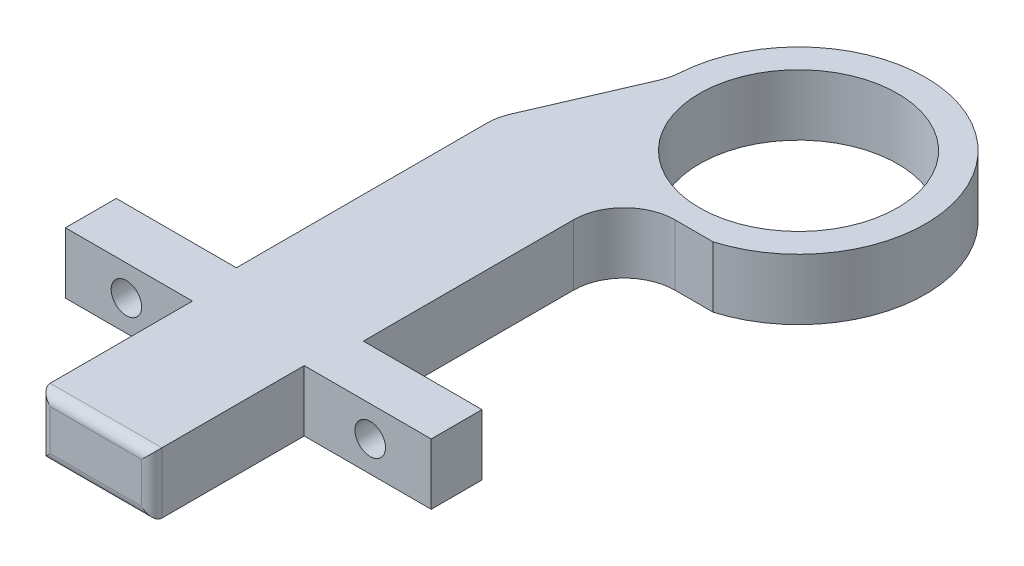
ISO-10303-21;
HEADER;
FILE_DESCRIPTION(('STEP AP214'),'2;1');
FILE_NAME('part.step','',(''),(''),'','','');
FILE_SCHEMA(('AUTOMOTIVE_DESIGN { 1 0 10303 214 1 1 1 1 }'));
ENDSEC;
DATA;
#1=APPLICATION_CONTEXT('core data for automotive mechanical design processes');
#2=APPLICATION_PROTOCOL_DEFINITION('international standard','automotive_design',2000,#1);
#3=PRODUCT_CONTEXT('',#1,'mechanical');
#4=PRODUCT('Part','Part','',(#3));
#5=PRODUCT_RELATED_PRODUCT_CATEGORY('part','',(#4));
#6=PRODUCT_DEFINITION_FORMATION('','',#4);
#7=PRODUCT_DEFINITION_CONTEXT('part definition',#1,'design');
#8=PRODUCT_DEFINITION('design','',#6,#7);
#9=PRODUCT_DEFINITION_SHAPE('','',#8);
#10=(LENGTH_UNIT() NAMED_UNIT(*) SI_UNIT(.MILLI.,.METRE.));
#11=(NAMED_UNIT(*) PLANE_ANGLE_UNIT() SI_UNIT($,.RADIAN.));
#12=(NAMED_UNIT(*) SI_UNIT($,.STERADIAN.) SOLID_ANGLE_UNIT());
#13=UNCERTAINTY_MEASURE_WITH_UNIT(LENGTH_MEASURE(1.E-05),#10,'distance_accuracy_value','');
#14=(GEOMETRIC_REPRESENTATION_CONTEXT(3) GLOBAL_UNCERTAINTY_ASSIGNED_CONTEXT((#13)) GLOBAL_UNIT_ASSIGNED_CONTEXT((#10,
#11,#12)) REPRESENTATION_CONTEXT('',''));
#15=CARTESIAN_POINT('',(0.,0.,0.));
#16=DIRECTION('',(0.,0.,1.));
#17=DIRECTION('',(1.,0.,0.));
#18=AXIS2_PLACEMENT_3D('',#15,#16,#17);
#19=CARTESIAN_POINT('',(0.,6.,16.));
#20=DIRECTION('',(0.,0.,1.));
#21=DIRECTION('',(1.,0.,0.));
#22=AXIS2_PLACEMENT_3D('',#19,#20,#21);
#23=PLANE('',#22);
#24=CARTESIAN_POINT('',(-12.,3.,16.));
#25=DIRECTION('',(0.,0.,1.));
#26=DIRECTION('',(1.,0.,0.));
#27=AXIS2_PLACEMENT_3D('',#24,#25,#26);
#28=CIRCLE('',#27,1.5);
#29=CARTESIAN_POINT('',(-10.5,3.,16.));
#30=VERTEX_POINT('',#29);
#31=EDGE_CURVE('E232',#30,#30,#28,.T.);
#32=ORIENTED_EDGE('',*,*,#31,.T.);
#33=EDGE_LOOP('',(#32));
#34=FACE_BOUND('',#33,.T.);
#35=DIRECTION('',(-1.,0.,0.));
#36=VECTOR('',#35,1.);
#37=CARTESIAN_POINT('',(0.,0.,16.));
#38=LINE('',#37,#36);
#39=CARTESIAN_POINT('',(-6.,0.,16.));
#40=VERTEX_POINT('',#39);
#41=CARTESIAN_POINT('',(-17.6776695296638,0.,16.));
#42=VERTEX_POINT('',#41);
#43=EDGE_CURVE('E192',#40,#42,#38,.T.);
#44=ORIENTED_EDGE('',*,*,#43,.T.);
#45=DIRECTION('',(0.,-1.,0.));
#46=VECTOR('',#45,1.);
#47=CARTESIAN_POINT('',(-17.6776695296638,6.,16.));
#48=LINE('',#47,#46);
#49=CARTESIAN_POINT('',(-17.6776695296638,6.,16.));
#50=VERTEX_POINT('',#49);
#51=EDGE_CURVE('E173',#50,#42,#48,.T.);
#52=ORIENTED_EDGE('',*,*,#51,.F.);
#53=DIRECTION('',(-1.,0.,0.));
#54=VECTOR('',#53,1.);
#55=CARTESIAN_POINT('',(0.,6.,16.));
#56=LINE('',#55,#54);
#57=CARTESIAN_POINT('',(-6.,6.,16.));
#58=VERTEX_POINT('',#57);
#59=EDGE_CURVE('E179',#58,#50,#56,.T.);
#60=ORIENTED_EDGE('',*,*,#59,.F.);
#61=DIRECTION('',(0.,-1.,0.));
#62=VECTOR('',#61,1.);
#63=CARTESIAN_POINT('',(-6.,6.,16.));
#64=LINE('',#63,#62);
#65=EDGE_CURVE('E270',#58,#40,#64,.T.);
#66=ORIENTED_EDGE('',*,*,#65,.T.);
#67=EDGE_LOOP('',(#44,#52,#60,#66));
#68=FACE_BOUND('',#67,.T.);
#69=ADVANCED_FACE('F35',(#34,#68),#23,.F.);
#70=CARTESIAN_POINT('',(-17.6776695296638,6.,0.));
#71=DIRECTION('',(-1.,0.,0.));
#72=DIRECTION('',(0.,0.,1.));
#73=AXIS2_PLACEMENT_3D('',#70,#71,#72);
#74=PLANE('',#73);
#75=DIRECTION('',(0.,0.,-1.));
#76=VECTOR('',#75,1.);
#77=CARTESIAN_POINT('',(-17.6776695296638,0.,0.));
#78=LINE('',#77,#76);
#79=CARTESIAN_POINT('',(-17.6776695296638,0.,-4.67169950086209));
#80=VERTEX_POINT('',#79);
#81=EDGE_CURVE('E272',#42,#80,#78,.T.);
#82=ORIENTED_EDGE('',*,*,#81,.T.);
#83=DIRECTION('',(0.,-1.,0.));
#84=VECTOR('',#83,1.);
#85=CARTESIAN_POINT('',(-17.6776695296638,6.,-4.67169950086209));
#86=LINE('',#85,#84);
#87=CARTESIAN_POINT('',(-17.6776695296638,6.,-4.67169950086209));
#88=VERTEX_POINT('',#87);
#89=EDGE_CURVE('E176',#88,#80,#86,.T.);
#90=ORIENTED_EDGE('',*,*,#89,.F.);
#91=DIRECTION('',(0.,0.,-1.));
#92=VECTOR('',#91,1.);
#93=CARTESIAN_POINT('',(-17.6776695296638,6.,0.));
#94=LINE('',#93,#92);
#95=EDGE_CURVE('E169',#50,#88,#94,.T.);
#96=ORIENTED_EDGE('',*,*,#95,.F.);
#97=ORIENTED_EDGE('',*,*,#51,.T.);
#98=EDGE_LOOP('',(#82,#90,#96,#97));
#99=FACE_BOUND('',#98,.T.);
#100=ADVANCED_FACE('F171',(#99),#74,.F.);
#101=CARTESIAN_POINT('',(-12.6776695296638,6.,-4.67169950086212));
#102=DIRECTION('',(0.,-1.,0.));
#103=DIRECTION('',(0.,0.,-1.));
#104=AXIS2_PLACEMENT_3D('',#101,#102,#103);
#105=CYLINDRICAL_SURFACE('',#104,5.);
#106=CARTESIAN_POINT('',(-12.6776695296638,0.,-4.67169950086212));
#107=DIRECTION('',(0.,1.,0.));
#108=DIRECTION('',(0.,0.,1.));
#109=AXIS2_PLACEMENT_3D('',#106,#107,#108);
#110=CIRCLE('',#109,5.);
#111=CARTESIAN_POINT('',(-12.6776695296638,0.,-9.67169950086212));
#112=VERTEX_POINT('',#111);
#113=EDGE_CURVE('E275',#80,#112,#110,.F.);
#114=ORIENTED_EDGE('',*,*,#113,.T.);
#115=DIRECTION('',(0.,-1.,0.));
#116=VECTOR('',#115,1.);
#117=CARTESIAN_POINT('',(-12.6776695296638,6.,-9.67169950086212));
#118=LINE('',#117,#116);
#119=CARTESIAN_POINT('',(-12.6776695296638,6.,-9.67169950086212));
#120=VERTEX_POINT('',#119);
#121=EDGE_CURVE('E197',#120,#112,#118,.T.);
#122=ORIENTED_EDGE('',*,*,#121,.F.);
#123=CARTESIAN_POINT('',(-12.6776695296638,6.,-4.67169950086212));
#124=DIRECTION('',(0.,1.,0.));
#125=DIRECTION('',(0.,0.,1.));
#126=AXIS2_PLACEMENT_3D('',#123,#124,#125);
#127=CIRCLE('',#126,5.);
#128=EDGE_CURVE('E178',#88,#120,#127,.F.);
#129=ORIENTED_EDGE('',*,*,#128,.F.);
#130=ORIENTED_EDGE('',*,*,#89,.T.);
#131=EDGE_LOOP('',(#114,#122,#129,#130));
#132=FACE_BOUND('',#131,.T.);
#133=ADVANCED_FACE('F343',(#132),#105,.F.);
#134=CARTESIAN_POINT('',(0.,6.,-9.67169950086212));
#135=DIRECTION('',(0.,0.,1.));
#136=DIRECTION('',(1.,0.,0.));
#137=AXIS2_PLACEMENT_3D('',#134,#135,#136);
#138=PLANE('',#137);
#139=DIRECTION('',(-1.,0.,0.));
#140=VECTOR('',#139,1.);
#141=CARTESIAN_POINT('',(0.,0.,-9.67169950086212));
#142=LINE('',#141,#140);
#143=CARTESIAN_POINT('',(-8.92857142857138,0.,-9.67169950086212));
#144=VERTEX_POINT('',#143);
#145=EDGE_CURVE('E278',#144,#112,#142,.T.);
#146=ORIENTED_EDGE('',*,*,#145,.F.);
#147=DIRECTION('',(0.,-1.,0.));
#148=VECTOR('',#147,1.);
#149=CARTESIAN_POINT('',(-8.92857142857138,6.,-9.67169950086212));
#150=LINE('',#149,#148);
#151=CARTESIAN_POINT('',(-8.92857142857138,6.,-9.67169950086212));
#152=VERTEX_POINT('',#151);
#153=EDGE_CURVE('E335',#152,#144,#150,.T.);
#154=ORIENTED_EDGE('',*,*,#153,.F.);
#155=DIRECTION('',(-1.,0.,0.));
#156=VECTOR('',#155,1.);
#157=CARTESIAN_POINT('',(0.,6.,-9.67169950086212));
#158=LINE('',#157,#156);
#159=EDGE_CURVE('E241',#152,#120,#158,.T.);
#160=ORIENTED_EDGE('',*,*,#159,.T.);
#161=ORIENTED_EDGE('',*,*,#121,.T.);
#162=EDGE_LOOP('',(#146,#154,#160,#161));
#163=FACE_BOUND('',#162,.T.);
#164=ADVANCED_FACE('F339',(#163),#138,.T.);
#165=CARTESIAN_POINT('',(-12.5,6.,-21.650635094611));
#166=DIRECTION('',(0.,-1.,0.));
#167=DIRECTION('',(0.,0.,-1.));
#168=AXIS2_PLACEMENT_3D('',#165,#166,#167);
#169=CYLINDRICAL_SURFACE('',#168,12.5);
#170=CARTESIAN_POINT('',(-12.5,0.,-21.650635094611));
#171=DIRECTION('',(0.,1.,0.));
#172=DIRECTION('',(0.,0.,1.));
#173=AXIS2_PLACEMENT_3D('',#170,#171,#172);
#174=CIRCLE('',#173,12.5);
#175=CARTESIAN_POINT('',(-24.9745166094324,0.,-22.4484040843536));
#176=VERTEX_POINT('',#175);
#177=EDGE_CURVE('E281',#144,#176,#174,.T.);
#178=ORIENTED_EDGE('',*,*,#177,.T.);
#179=DIRECTION('',(0.,-1.,0.));
#180=VECTOR('',#179,1.);
#181=CARTESIAN_POINT('',(-24.9745166094324,6.,-22.4484040843536));
#182=LINE('',#181,#180);
#183=CARTESIAN_POINT('',(-24.9745166094324,6.,-22.4484040843536));
#184=VERTEX_POINT('',#183);
#185=EDGE_CURVE('E332',#184,#176,#182,.T.);
#186=ORIENTED_EDGE('',*,*,#185,.F.);
#187=CARTESIAN_POINT('',(-12.5,6.,-21.650635094611));
#188=DIRECTION('',(0.,1.,0.));
#189=DIRECTION('',(0.,0.,1.));
#190=AXIS2_PLACEMENT_3D('',#187,#188,#189);
#191=CIRCLE('',#190,12.5);
#192=EDGE_CURVE('E244',#152,#184,#191,.T.);
#193=ORIENTED_EDGE('',*,*,#192,.F.);
#194=ORIENTED_EDGE('',*,*,#153,.T.);
#195=EDGE_LOOP('',(#178,#186,#193,#194));
#196=FACE_BOUND('',#195,.T.);
#197=ADVANCED_FACE('F351',(#196),#169,.T.);
#198=CARTESIAN_POINT('',(-29.9643232532053,6.,-22.7675116802506));
#199=DIRECTION('',(0.,-1.,0.));
#200=DIRECTION('',(0.,0.,-1.));
#201=AXIS2_PLACEMENT_3D('',#198,#199,#200);
#202=CYLINDRICAL_SURFACE('',#201,5.);
#203=CARTESIAN_POINT('',(-29.9643232532053,0.,-22.7675116802506));
#204=DIRECTION('',(0.,1.,0.));
#205=DIRECTION('',(0.,0.,1.));
#206=AXIS2_PLACEMENT_3D('',#203,#204,#205);
#207=CIRCLE('',#206,5.);
#208=CARTESIAN_POINT('',(-25.3747016471425,0.,-20.7837340936344));
#209=VERTEX_POINT('',#208);
#210=EDGE_CURVE('E283',#176,#209,#207,.F.);
#211=ORIENTED_EDGE('',*,*,#210,.T.);
#212=DIRECTION('',(0.,-1.,0.));
#213=VECTOR('',#212,1.);
#214=CARTESIAN_POINT('',(-25.3747016471425,6.,-20.7837340936344));
#215=LINE('',#214,#213);
#216=CARTESIAN_POINT('',(-25.3747016471425,6.,-20.7837340936344));
#217=VERTEX_POINT('',#216);
#218=EDGE_CURVE('E330',#217,#209,#215,.T.);
#219=ORIENTED_EDGE('',*,*,#218,.F.);
#220=CARTESIAN_POINT('',(-29.9643232532053,6.,-22.7675116802506));
#221=DIRECTION('',(0.,1.,0.));
#222=DIRECTION('',(0.,0.,1.));
#223=AXIS2_PLACEMENT_3D('',#220,#221,#222);
#224=CIRCLE('',#223,5.);
#225=EDGE_CURVE('E246',#184,#217,#224,.F.);
#226=ORIENTED_EDGE('',*,*,#225,.F.);
#227=ORIENTED_EDGE('',*,*,#185,.T.);
#228=EDGE_LOOP('',(#211,#219,#226,#227));
#229=FACE_BOUND('',#228,.T.);
#230=ADVANCED_FACE('F355',(#229),#202,.F.);
#231=CARTESIAN_POINT('',(-28.9496046006768,6.,-12.5129219089349));
#232=DIRECTION('',(-0.917924321212573,0.,-0.396755517323247));
#233=DIRECTION('',(-0.396755517323247,0.,0.917924321212573));
#234=AXIS2_PLACEMENT_3D('',#231,#232,#233);
#235=PLANE('',#234);
#236=DIRECTION('',(0.396755517323247,0.,-0.917924321212573));
#237=VECTOR('',#236,1.);
#238=CARTESIAN_POINT('',(-28.9496046006768,0.,-12.5129219089349));
#239=LINE('',#238,#237);
#240=CARTESIAN_POINT('',(-29.7672911357266,0.,-10.6211413920209));
#241=VERTEX_POINT('',#240);
#242=EDGE_CURVE('E286',#241,#209,#239,.T.);
#243=ORIENTED_EDGE('',*,*,#242,.F.);
#244=DIRECTION('',(0.,-1.,0.));
#245=VECTOR('',#244,1.);
#246=CARTESIAN_POINT('',(-29.7672911357266,6.,-10.6211413920209));
#247=LINE('',#246,#245);
#248=CARTESIAN_POINT('',(-29.7672911357266,6.,-10.6211413920209));
#249=VERTEX_POINT('',#248);
#250=EDGE_CURVE('E328',#249,#241,#247,.T.);
#251=ORIENTED_EDGE('',*,*,#250,.F.);
#252=DIRECTION('',(0.396755517323247,0.,-0.917924321212573));
#253=VECTOR('',#252,1.);
#254=CARTESIAN_POINT('',(-28.9496046006768,6.,-12.5129219089349));
#255=LINE('',#254,#253);
#256=EDGE_CURVE('E248',#249,#217,#255,.T.);
#257=ORIENTED_EDGE('',*,*,#256,.T.);
#258=ORIENTED_EDGE('',*,*,#218,.T.);
#259=EDGE_LOOP('',(#243,#251,#257,#258));
#260=FACE_BOUND('',#259,.T.);
#261=ADVANCED_FACE('F515',(#260),#235,.T.);
#262=CARTESIAN_POINT('',(-25.1776695296638,6.,-8.63736380540464));
#263=DIRECTION('',(0.,-1.,0.));
#264=DIRECTION('',(0.,0.,-1.));
#265=AXIS2_PLACEMENT_3D('',#262,#263,#264);
#266=CYLINDRICAL_SURFACE('',#265,5.);
#267=CARTESIAN_POINT('',(-25.1776695296638,0.,-8.63736380540464));
#268=DIRECTION('',(0.,1.,0.));
#269=DIRECTION('',(0.,0.,1.));
#270=AXIS2_PLACEMENT_3D('',#267,#268,#269);
#271=CIRCLE('',#270,5.);
#272=CARTESIAN_POINT('',(-30.1776695296638,0.,-8.63736380540462));
#273=VERTEX_POINT('',#272);
#274=EDGE_CURVE('E289',#273,#241,#271,.F.);
#275=ORIENTED_EDGE('',*,*,#274,.F.);
#276=DIRECTION('',(0.,-1.,0.));
#277=VECTOR('',#276,1.);
#278=CARTESIAN_POINT('',(-30.1776695296638,6.,-8.63736380540462));
#279=LINE('',#278,#277);
#280=CARTESIAN_POINT('',(-30.1776695296638,6.,-8.63736380540462));
#281=VERTEX_POINT('',#280);
#282=EDGE_CURVE('E326',#281,#273,#279,.T.);
#283=ORIENTED_EDGE('',*,*,#282,.F.);
#284=CARTESIAN_POINT('',(-25.1776695296638,6.,-8.63736380540464));
#285=DIRECTION('',(0.,1.,0.));
#286=DIRECTION('',(0.,0.,1.));
#287=AXIS2_PLACEMENT_3D('',#284,#285,#286);
#288=CIRCLE('',#287,5.);
#289=EDGE_CURVE('E251',#281,#249,#288,.F.);
#290=ORIENTED_EDGE('',*,*,#289,.T.);
#291=ORIENTED_EDGE('',*,*,#250,.T.);
#292=EDGE_LOOP('',(#275,#283,#290,#291));
#293=FACE_BOUND('',#292,.T.);
#294=ADVANCED_FACE('F363',(#293),#266,.T.);
#295=CARTESIAN_POINT('',(-30.1776695296638,6.,0.));
#296=DIRECTION('',(-1.,0.,0.));
#297=DIRECTION('',(0.,0.,1.));
#298=AXIS2_PLACEMENT_3D('',#295,#296,#297);
#299=PLANE('',#298);
#300=DIRECTION('',(0.,0.,-1.));
#301=VECTOR('',#300,1.);
#302=CARTESIAN_POINT('',(-30.1776695296638,0.,0.));
#303=LINE('',#302,#301);
#304=CARTESIAN_POINT('',(-30.1776695296638,0.,16.));
#305=VERTEX_POINT('',#304);
#306=EDGE_CURVE('E292',#305,#273,#303,.T.);
#307=ORIENTED_EDGE('',*,*,#306,.F.);
#308=DIRECTION('',(0.,-1.,0.));
#309=VECTOR('',#308,1.);
#310=CARTESIAN_POINT('',(-30.1776695296638,6.,16.));
#311=LINE('',#310,#309);
#312=CARTESIAN_POINT('',(-30.1776695296638,6.,16.));
#313=VERTEX_POINT('',#312);
#314=EDGE_CURVE('E324',#313,#305,#311,.T.);
#315=ORIENTED_EDGE('',*,*,#314,.F.);
#316=DIRECTION('',(0.,0.,-1.));
#317=VECTOR('',#316,1.);
#318=CARTESIAN_POINT('',(-30.1776695296638,6.,0.));
#319=LINE('',#318,#317);
#320=EDGE_CURVE('E254',#313,#281,#319,.T.);
#321=ORIENTED_EDGE('',*,*,#320,.T.);
#322=ORIENTED_EDGE('',*,*,#282,.T.);
#323=EDGE_LOOP('',(#307,#315,#321,#322));
#324=FACE_BOUND('',#323,.T.);
#325=ADVANCED_FACE('F367',(#324),#299,.T.);
#326=CARTESIAN_POINT('',(-36.,3.,16.));
#327=DIRECTION('',(0.,0.,1.));
#328=DIRECTION('',(1.,0.,0.));
#329=AXIS2_PLACEMENT_3D('',#326,#327,#328);
#330=CIRCLE('',#329,1.5);
#331=CARTESIAN_POINT('',(-34.5,3.,16.));
#332=VERTEX_POINT('',#331);
#333=EDGE_CURVE('E237',#332,#332,#330,.T.);
#334=ORIENTED_EDGE('',*,*,#333,.T.);
#335=EDGE_LOOP('',(#334));
#336=FACE_BOUND('',#335,.T.);
#337=CARTESIAN_POINT('',(-42.,0.,16.));
#338=VERTEX_POINT('',#337);
#339=EDGE_CURVE('E273',#305,#338,#38,.T.);
#340=ORIENTED_EDGE('',*,*,#339,.T.);
#341=DIRECTION('',(0.,-1.,0.));
#342=VECTOR('',#341,1.);
#343=CARTESIAN_POINT('',(-42.,6.,16.));
#344=LINE('',#343,#342);
#345=CARTESIAN_POINT('',(-42.,6.,16.));
#346=VERTEX_POINT('',#345);
#347=EDGE_CURVE('E321',#346,#338,#344,.T.);
#348=ORIENTED_EDGE('',*,*,#347,.F.);
#349=EDGE_CURVE('E190',#313,#346,#56,.T.);
#350=ORIENTED_EDGE('',*,*,#349,.F.);
#351=ORIENTED_EDGE('',*,*,#314,.T.);
#352=EDGE_LOOP('',(#340,#348,#350,#351));
#353=FACE_BOUND('',#352,.T.);
#354=ADVANCED_FACE('F373',(#336,#353),#23,.F.);
#355=CARTESIAN_POINT('',(-42.,6.,0.));
#356=DIRECTION('',(1.,0.,0.));
#357=DIRECTION('',(0.,0.,-1.));
#358=AXIS2_PLACEMENT_3D('',#355,#356,#357);
#359=PLANE('',#358);
#360=DIRECTION('',(0.,0.,1.));
#361=VECTOR('',#360,1.);
#362=CARTESIAN_POINT('',(-42.,0.,0.));
#363=LINE('',#362,#361);
#364=CARTESIAN_POINT('',(-42.,0.,21.));
#365=VERTEX_POINT('',#364);
#366=EDGE_CURVE('E295',#338,#365,#363,.T.);
#367=ORIENTED_EDGE('',*,*,#366,.T.);
#368=DIRECTION('',(0.,-1.,0.));
#369=VECTOR('',#368,1.);
#370=CARTESIAN_POINT('',(-42.,6.,21.));
#371=LINE('',#370,#369);
#372=CARTESIAN_POINT('',(-42.,6.,21.));
#373=VERTEX_POINT('',#372);
#374=EDGE_CURVE('E318',#373,#365,#371,.T.);
#375=ORIENTED_EDGE('',*,*,#374,.F.);
#376=DIRECTION('',(0.,0.,1.));
#377=VECTOR('',#376,1.);
#378=CARTESIAN_POINT('',(-42.,6.,0.));
#379=LINE('',#378,#377);
#380=EDGE_CURVE('E257',#346,#373,#379,.T.);
#381=ORIENTED_EDGE('',*,*,#380,.F.);
#382=ORIENTED_EDGE('',*,*,#347,.T.);
#383=EDGE_LOOP('',(#367,#375,#381,#382));
#384=FACE_BOUND('',#383,.T.);
#385=ADVANCED_FACE('F377',(#384),#359,.F.);
#386=CARTESIAN_POINT('',(0.,6.,21.));
#387=DIRECTION('',(0.,0.,-1.));
#388=DIRECTION('',(-1.,0.,0.));
#389=AXIS2_PLACEMENT_3D('',#386,#387,#388);
#390=PLANE('',#389);
#391=CARTESIAN_POINT('',(-36.,3.,21.));
#392=DIRECTION('',(0.,0.,1.));
#393=DIRECTION('',(1.,0.,0.));
#394=AXIS2_PLACEMENT_3D('',#391,#392,#393);
#395=CIRCLE('',#394,1.5);
#396=CARTESIAN_POINT('',(-34.5,3.,21.));
#397=VERTEX_POINT('',#396);
#398=EDGE_CURVE('E227',#397,#397,#395,.T.);
#399=ORIENTED_EDGE('',*,*,#398,.F.);
#400=EDGE_LOOP('',(#399));
#401=FACE_BOUND('',#400,.T.);
#402=DIRECTION('',(1.,0.,0.));
#403=VECTOR('',#402,1.);
#404=CARTESIAN_POINT('',(0.,0.,21.));
#405=LINE('',#404,#403);
#406=CARTESIAN_POINT('',(-29.5,0.,21.));
#407=VERTEX_POINT('',#406);
#408=EDGE_CURVE('E297',#365,#407,#405,.T.);
#409=ORIENTED_EDGE('',*,*,#408,.T.);
#410=DIRECTION('',(0.,-1.,0.));
#411=VECTOR('',#410,1.);
#412=CARTESIAN_POINT('',(-29.5,6.,21.));
#413=LINE('',#412,#411);
#414=CARTESIAN_POINT('',(-29.5,6.,21.));
#415=VERTEX_POINT('',#414);
#416=EDGE_CURVE('E315',#415,#407,#413,.T.);
#417=ORIENTED_EDGE('',*,*,#416,.F.);
#418=DIRECTION('',(1.,0.,0.));
#419=VECTOR('',#418,1.);
#420=CARTESIAN_POINT('',(0.,6.,21.));
#421=LINE('',#420,#419);
#422=EDGE_CURVE('E259',#373,#415,#421,.T.);
#423=ORIENTED_EDGE('',*,*,#422,.F.);
#424=ORIENTED_EDGE('',*,*,#374,.T.);
#425=EDGE_LOOP('',(#409,#417,#423,#424));
#426=FACE_BOUND('',#425,.T.);
#427=ADVANCED_FACE('F382',(#401,#426),#390,.F.);
#428=CARTESIAN_POINT('',(-29.5,6.,0.));
#429=DIRECTION('',(1.,0.,0.));
#430=DIRECTION('',(0.,0.,-1.));
#431=AXIS2_PLACEMENT_3D('',#428,#429,#430);
#432=PLANE('',#431);
#433=DIRECTION('',(0.,0.,1.));
#434=VECTOR('',#433,1.);
#435=CARTESIAN_POINT('',(-29.5,0.,0.));
#436=LINE('',#435,#434);
#437=CARTESIAN_POINT('',(-29.5,0.,35.));
#438=VERTEX_POINT('',#437);
#439=EDGE_CURVE('E299',#407,#438,#436,.T.);
#440=ORIENTED_EDGE('',*,*,#439,.T.);
#441=DIRECTION('',(0.,-1.,0.));
#442=VECTOR('',#441,1.);
#443=CARTESIAN_POINT('',(-29.5,6.,35.));
#444=LINE('',#443,#442);
#445=CARTESIAN_POINT('',(-29.5,6.,35.));
#446=VERTEX_POINT('',#445);
#447=EDGE_CURVE('E207',#438,#446,#444,.F.);
#448=ORIENTED_EDGE('',*,*,#447,.T.);
#449=DIRECTION('',(0.,0.,1.));
#450=VECTOR('',#449,1.);
#451=CARTESIAN_POINT('',(-29.5,6.,0.));
#452=LINE('',#451,#450);
#453=EDGE_CURVE('E261',#415,#446,#452,.T.);
#454=ORIENTED_EDGE('',*,*,#453,.F.);
#455=ORIENTED_EDGE('',*,*,#416,.T.);
#456=EDGE_LOOP('',(#440,#448,#454,#455));
#457=FACE_BOUND('',#456,.T.);
#458=ADVANCED_FACE('F385',(#457),#432,.F.);
#459=CARTESIAN_POINT('',(0.,6.,36.));
#460=DIRECTION('',(0.,0.,-1.));
#461=DIRECTION('',(-1.,0.,0.));
#462=AXIS2_PLACEMENT_3D('',#459,#460,#461);
#463=PLANE('',#462);
#464=DIRECTION('',(1.,0.,0.));
#465=VECTOR('',#464,1.);
#466=CARTESIAN_POINT('',(-29.5,5.,36.));
#467=LINE('',#466,#465);
#468=CARTESIAN_POINT('',(-19.5,5.,36.));
#469=VERTEX_POINT('',#468);
#470=CARTESIAN_POINT('',(-28.5,5.,36.));
#471=VERTEX_POINT('',#470);
#472=EDGE_CURVE('E202',#469,#471,#467,.F.);
#473=ORIENTED_EDGE('',*,*,#472,.T.);
#474=DIRECTION('',(0.,-1.,0.));
#475=VECTOR('',#474,1.);
#476=CARTESIAN_POINT('',(-28.5,6.,36.));
#477=LINE('',#476,#475);
#478=CARTESIAN_POINT('',(-28.5,1.,36.));
#479=VERTEX_POINT('',#478);
#480=EDGE_CURVE('E204',#471,#479,#477,.T.);
#481=ORIENTED_EDGE('',*,*,#480,.T.);
#482=DIRECTION('',(1.,0.,0.));
#483=VECTOR('',#482,1.);
#484=CARTESIAN_POINT('',(0.,1.,36.));
#485=LINE('',#484,#483);
#486=CARTESIAN_POINT('',(-19.5,1.,36.));
#487=VERTEX_POINT('',#486);
#488=EDGE_CURVE('E193',#479,#487,#485,.T.);
#489=ORIENTED_EDGE('',*,*,#488,.T.);
#490=DIRECTION('',(0.,-1.,0.));
#491=VECTOR('',#490,1.);
#492=CARTESIAN_POINT('',(-19.5,6.,36.));
#493=LINE('',#492,#491);
#494=EDGE_CURVE('E195',#487,#469,#493,.F.);
#495=ORIENTED_EDGE('',*,*,#494,.T.);
#496=EDGE_LOOP('',(#473,#481,#489,#495));
#497=FACE_BOUND('',#496,.T.);
#498=ADVANCED_FACE('F396',(#497),#463,.F.);
#499=CARTESIAN_POINT('',(-18.5,6.,0.));
#500=DIRECTION('',(1.,0.,0.));
#501=DIRECTION('',(0.,0.,-1.));
#502=AXIS2_PLACEMENT_3D('',#499,#500,#501);
#503=PLANE('',#502);
#504=DIRECTION('',(0.,0.,1.));
#505=VECTOR('',#504,1.);
#506=CARTESIAN_POINT('',(-18.5,6.,0.));
#507=LINE('',#506,#505);
#508=CARTESIAN_POINT('',(-18.5,6.,21.));
#509=VERTEX_POINT('',#508);
#510=CARTESIAN_POINT('',(-18.5,6.,35.));
#511=VERTEX_POINT('',#510);
#512=EDGE_CURVE('E264',#509,#511,#507,.T.);
#513=ORIENTED_EDGE('',*,*,#512,.T.);
#514=DIRECTION('',(0.,-1.,0.));
#515=VECTOR('',#514,1.);
#516=CARTESIAN_POINT('',(-18.5,0.,35.));
#517=LINE('',#516,#515);
#518=CARTESIAN_POINT('',(-18.5,0.,35.));
#519=VERTEX_POINT('',#518);
#520=EDGE_CURVE('E44',#511,#519,#517,.T.);
#521=ORIENTED_EDGE('',*,*,#520,.T.);
#522=DIRECTION('',(0.,0.,1.));
#523=VECTOR('',#522,1.);
#524=CARTESIAN_POINT('',(-18.5,0.,0.));
#525=LINE('',#524,#523);
#526=CARTESIAN_POINT('',(-18.5,0.,21.));
#527=VERTEX_POINT('',#526);
#528=EDGE_CURVE('E303',#527,#519,#525,.T.);
#529=ORIENTED_EDGE('',*,*,#528,.F.);
#530=DIRECTION('',(0.,-1.,0.));
#531=VECTOR('',#530,1.);
#532=CARTESIAN_POINT('',(-18.5,6.,21.));
#533=LINE('',#532,#531);
#534=EDGE_CURVE('E313',#509,#527,#533,.T.);
#535=ORIENTED_EDGE('',*,*,#534,.F.);
#536=EDGE_LOOP('',(#513,#521,#529,#535));
#537=FACE_BOUND('',#536,.T.);
#538=ADVANCED_FACE('F447',(#537),#503,.T.);
#539=CARTESIAN_POINT('',(-12.,3.,21.));
#540=DIRECTION('',(0.,0.,1.));
#541=DIRECTION('',(1.,0.,0.));
#542=AXIS2_PLACEMENT_3D('',#539,#540,#541);
#543=CIRCLE('',#542,1.5);
#544=CARTESIAN_POINT('',(-10.5,3.,21.));
#545=VERTEX_POINT('',#544);
#546=EDGE_CURVE('E222',#545,#545,#543,.T.);
#547=ORIENTED_EDGE('',*,*,#546,.F.);
#548=EDGE_LOOP('',(#547));
#549=FACE_BOUND('',#548,.T.);
#550=CARTESIAN_POINT('',(-6.,0.,21.));
#551=VERTEX_POINT('',#550);
#552=EDGE_CURVE('E300',#527,#551,#405,.T.);
#553=ORIENTED_EDGE('',*,*,#552,.T.);
#554=DIRECTION('',(0.,-1.,0.));
#555=VECTOR('',#554,1.);
#556=CARTESIAN_POINT('',(-6.,6.,21.));
#557=LINE('',#556,#555);
#558=CARTESIAN_POINT('',(-6.,6.,21.));
#559=VERTEX_POINT('',#558);
#560=EDGE_CURVE('E311',#559,#551,#557,.T.);
#561=ORIENTED_EDGE('',*,*,#560,.F.);
#562=EDGE_CURVE('E262',#509,#559,#421,.T.);
#563=ORIENTED_EDGE('',*,*,#562,.F.);
#564=ORIENTED_EDGE('',*,*,#534,.T.);
#565=EDGE_LOOP('',(#553,#561,#563,#564));
#566=FACE_BOUND('',#565,.T.);
#567=ADVANCED_FACE('F443',(#549,#566),#390,.F.);
#568=CARTESIAN_POINT('',(-6.,6.,0.));
#569=DIRECTION('',(1.,0.,0.));
#570=DIRECTION('',(0.,0.,-1.));
#571=AXIS2_PLACEMENT_3D('',#568,#569,#570);
#572=PLANE('',#571);
#573=DIRECTION('',(0.,0.,1.));
#574=VECTOR('',#573,1.);
#575=CARTESIAN_POINT('',(-6.,0.,0.));
#576=LINE('',#575,#574);
#577=EDGE_CURVE('E305',#40,#551,#576,.T.);
#578=ORIENTED_EDGE('',*,*,#577,.F.);
#579=ORIENTED_EDGE('',*,*,#65,.F.);
#580=DIRECTION('',(0.,0.,1.));
#581=VECTOR('',#580,1.);
#582=CARTESIAN_POINT('',(-6.,6.,0.));
#583=LINE('',#582,#581);
#584=EDGE_CURVE('E186',#58,#559,#583,.T.);
#585=ORIENTED_EDGE('',*,*,#584,.T.);
#586=ORIENTED_EDGE('',*,*,#560,.T.);
#587=EDGE_LOOP('',(#578,#579,#585,#586));
#588=FACE_BOUND('',#587,.T.);
#589=ADVANCED_FACE('F439',(#588),#572,.T.);
#590=CARTESIAN_POINT('',(-12.5,6.,-21.650635094611));
#591=DIRECTION('',(0.,-1.,0.));
#592=DIRECTION('',(0.,0.,-1.));
#593=AXIS2_PLACEMENT_3D('',#590,#591,#592);
#594=CYLINDRICAL_SURFACE('',#593,9.75);
#595=CARTESIAN_POINT('',(-12.5,6.,-21.650635094611));
#596=DIRECTION('',(0.,1.,0.));
#597=DIRECTION('',(0.,0.,1.));
#598=AXIS2_PLACEMENT_3D('',#595,#596,#597);
#599=CIRCLE('',#598,9.75);
#600=CARTESIAN_POINT('',(-12.5,6.,-11.900635094611));
#601=VERTEX_POINT('',#600);
#602=EDGE_CURVE('E267',#601,#601,#599,.T.);
#603=ORIENTED_EDGE('',*,*,#602,.T.);
#604=EDGE_LOOP('',(#603));
#605=FACE_BOUND('',#604,.T.);
#606=CARTESIAN_POINT('',(-12.5,0.,-21.650635094611));
#607=DIRECTION('',(0.,1.,0.));
#608=DIRECTION('',(0.,0.,1.));
#609=AXIS2_PLACEMENT_3D('',#606,#607,#608);
#610=CIRCLE('',#609,9.75);
#611=CARTESIAN_POINT('',(-12.5,0.,-11.900635094611));
#612=VERTEX_POINT('',#611);
#613=EDGE_CURVE('E188',#612,#612,#610,.T.);
#614=ORIENTED_EDGE('',*,*,#613,.F.);
#615=EDGE_LOOP('',(#614));
#616=FACE_BOUND('',#615,.T.);
#617=ADVANCED_FACE('F434',(#605,#616),#594,.F.);
#618=CARTESIAN_POINT('',(0.,6.,0.));
#619=DIRECTION('',(0.,1.,0.));
#620=DIRECTION('',(0.,0.,1.));
#621=AXIS2_PLACEMENT_3D('',#618,#619,#620);
#622=PLANE('',#621);
#623=ORIENTED_EDGE('',*,*,#453,.T.);
#624=DIRECTION('',(1.,0.,0.));
#625=VECTOR('',#624,1.);
#626=CARTESIAN_POINT('',(-18.5,6.,35.));
#627=LINE('',#626,#625);
#628=EDGE_CURVE('E59',#446,#511,#627,.T.);
#629=ORIENTED_EDGE('',*,*,#628,.T.);
#630=ORIENTED_EDGE('',*,*,#512,.F.);
#631=ORIENTED_EDGE('',*,*,#562,.T.);
#632=ORIENTED_EDGE('',*,*,#584,.F.);
#633=ORIENTED_EDGE('',*,*,#59,.T.);
#634=ORIENTED_EDGE('',*,*,#95,.T.);
#635=ORIENTED_EDGE('',*,*,#128,.T.);
#636=ORIENTED_EDGE('',*,*,#159,.F.);
#637=ORIENTED_EDGE('',*,*,#192,.T.);
#638=ORIENTED_EDGE('',*,*,#225,.T.);
#639=ORIENTED_EDGE('',*,*,#256,.F.);
#640=ORIENTED_EDGE('',*,*,#289,.F.);
#641=ORIENTED_EDGE('',*,*,#320,.F.);
#642=ORIENTED_EDGE('',*,*,#349,.T.);
#643=ORIENTED_EDGE('',*,*,#380,.T.);
#644=ORIENTED_EDGE('',*,*,#422,.T.);
#645=EDGE_LOOP('',(#623,#629,#630,#631,#632,#633,#634,#635,#636,#637,#638,#639,#640,#641,#642,
#643,#644));
#646=FACE_BOUND('',#645,.T.);
#647=ORIENTED_EDGE('',*,*,#602,.F.);
#648=EDGE_LOOP('',(#647));
#649=FACE_BOUND('',#648,.T.);
#650=ADVANCED_FACE('F183',(#646,#649),#622,.T.);
#651=CARTESIAN_POINT('',(0.,0.,0.));
#652=DIRECTION('',(0.,1.,0.));
#653=DIRECTION('',(0.,0.,1.));
#654=AXIS2_PLACEMENT_3D('',#651,#652,#653);
#655=PLANE('',#654);
#656=ORIENTED_EDGE('',*,*,#528,.T.);
#657=DIRECTION('',(1.,0.,0.));
#658=VECTOR('',#657,1.);
#659=CARTESIAN_POINT('',(0.,0.,35.));
#660=LINE('',#659,#658);
#661=EDGE_CURVE('E11',#519,#438,#660,.F.);
#662=ORIENTED_EDGE('',*,*,#661,.T.);
#663=ORIENTED_EDGE('',*,*,#439,.F.);
#664=ORIENTED_EDGE('',*,*,#408,.F.);
#665=ORIENTED_EDGE('',*,*,#366,.F.);
#666=ORIENTED_EDGE('',*,*,#339,.F.);
#667=ORIENTED_EDGE('',*,*,#306,.T.);
#668=ORIENTED_EDGE('',*,*,#274,.T.);
#669=ORIENTED_EDGE('',*,*,#242,.T.);
#670=ORIENTED_EDGE('',*,*,#210,.F.);
#671=ORIENTED_EDGE('',*,*,#177,.F.);
#672=ORIENTED_EDGE('',*,*,#145,.T.);
#673=ORIENTED_EDGE('',*,*,#113,.F.);
#674=ORIENTED_EDGE('',*,*,#81,.F.);
#675=ORIENTED_EDGE('',*,*,#43,.F.);
#676=ORIENTED_EDGE('',*,*,#577,.T.);
#677=ORIENTED_EDGE('',*,*,#552,.F.);
#678=EDGE_LOOP('',(#656,#662,#663,#664,#665,#666,#667,#668,#669,#670,#671,#672,#673,#674,#675,
#676,#677));
#679=FACE_BOUND('',#678,.T.);
#680=ORIENTED_EDGE('',*,*,#613,.T.);
#681=EDGE_LOOP('',(#680));
#682=FACE_BOUND('',#681,.T.);
#683=ADVANCED_FACE('F346',(#679,#682),#655,.F.);
#684=CARTESIAN_POINT('',(-12.,3.,15.));
#685=DIRECTION('',(0.,0.,1.));
#686=DIRECTION('',(1.,0.,0.));
#687=AXIS2_PLACEMENT_3D('',#684,#685,#686);
#688=CYLINDRICAL_SURFACE('',#687,1.5);
#689=ORIENTED_EDGE('',*,*,#546,.T.);
#690=EDGE_LOOP('',(#689));
#691=FACE_BOUND('',#690,.T.);
#692=ORIENTED_EDGE('',*,*,#31,.F.);
#693=EDGE_LOOP('',(#692));
#694=FACE_BOUND('',#693,.T.);
#695=ADVANCED_FACE('F424',(#691,#694),#688,.F.);
#696=CARTESIAN_POINT('',(-36.,3.,15.));
#697=DIRECTION('',(0.,0.,1.));
#698=DIRECTION('',(1.,0.,0.));
#699=AXIS2_PLACEMENT_3D('',#696,#697,#698);
#700=CYLINDRICAL_SURFACE('',#699,1.5);
#701=ORIENTED_EDGE('',*,*,#398,.T.);
#702=EDGE_LOOP('',(#701));
#703=FACE_BOUND('',#702,.T.);
#704=ORIENTED_EDGE('',*,*,#333,.F.);
#705=EDGE_LOOP('',(#704));
#706=FACE_BOUND('',#705,.T.);
#707=ADVANCED_FACE('F404',(#703,#706),#700,.F.);
#708=CARTESIAN_POINT('',(-19.5,6.,35.));
#709=DIRECTION('',(0.,1.,0.));
#710=DIRECTION('',(0.,0.,1.));
#711=AXIS2_PLACEMENT_3D('',#708,#709,#710);
#712=CYLINDRICAL_SURFACE('',#711,1.);
#713=CARTESIAN_POINT('',(-19.5,1.,35.));
#714=DIRECTION('',(0.707106781186547,0.707106781186547,0.));
#715=DIRECTION('',(0.707106781186547,-0.707106781186547,0.));
#716=AXIS2_PLACEMENT_3D('',#713,#714,#715);
#717=ELLIPSE('',#716,1.41421356237309,1.);
#718=EDGE_CURVE('E215',#519,#487,#717,.F.);
#719=ORIENTED_EDGE('',*,*,#718,.F.);
#720=ORIENTED_EDGE('',*,*,#520,.F.);
#721=CARTESIAN_POINT('',(-19.5,5.,35.));
#722=DIRECTION('',(-0.707106781186547,0.707106781186547,0.));
#723=DIRECTION('',(0.707106781186547,0.707106781186547,0.));
#724=AXIS2_PLACEMENT_3D('',#721,#722,#723);
#725=ELLIPSE('',#724,1.41421356237309,1.);
#726=EDGE_CURVE('E39',#469,#511,#725,.T.);
#727=ORIENTED_EDGE('',*,*,#726,.F.);
#728=ORIENTED_EDGE('',*,*,#494,.F.);
#729=EDGE_LOOP('',(#719,#720,#727,#728));
#730=FACE_BOUND('',#729,.T.);
#731=ADVANCED_FACE('F37',(#730),#712,.T.);
#732=CARTESIAN_POINT('',(0.,5.,35.));
#733=DIRECTION('',(-1.,0.,0.));
#734=DIRECTION('',(0.,0.,1.));
#735=AXIS2_PLACEMENT_3D('',#732,#733,#734);
#736=CYLINDRICAL_SURFACE('',#735,1.);
#737=ORIENTED_EDGE('',*,*,#726,.T.);
#738=ORIENTED_EDGE('',*,*,#628,.F.);
#739=CARTESIAN_POINT('',(-28.5,5.,35.));
#740=DIRECTION('',(-0.707106781186547,-0.707106781186547,0.));
#741=DIRECTION('',(-0.707106781186547,0.707106781186547,0.));
#742=AXIS2_PLACEMENT_3D('',#739,#740,#741);
#743=ELLIPSE('',#742,1.41421356237309,1.);
#744=EDGE_CURVE('E214',#471,#446,#743,.T.);
#745=ORIENTED_EDGE('',*,*,#744,.F.);
#746=ORIENTED_EDGE('',*,*,#472,.F.);
#747=EDGE_LOOP('',(#737,#738,#745,#746));
#748=FACE_BOUND('',#747,.T.);
#749=ADVANCED_FACE('F397',(#748),#736,.T.);
#750=CARTESIAN_POINT('',(0.,1.,35.));
#751=DIRECTION('',(1.,0.,0.));
#752=DIRECTION('',(0.,0.,-1.));
#753=AXIS2_PLACEMENT_3D('',#750,#751,#752);
#754=CYLINDRICAL_SURFACE('',#753,1.);
#755=ORIENTED_EDGE('',*,*,#718,.T.);
#756=ORIENTED_EDGE('',*,*,#488,.F.);
#757=CARTESIAN_POINT('',(-28.5,1.,35.));
#758=DIRECTION('',(0.707106781186547,-0.707106781186547,0.));
#759=DIRECTION('',(0.707106781186547,0.707106781186547,0.));
#760=AXIS2_PLACEMENT_3D('',#757,#758,#759);
#761=ELLIPSE('',#760,1.41421356237309,1.);
#762=EDGE_CURVE('E212',#438,#479,#761,.F.);
#763=ORIENTED_EDGE('',*,*,#762,.F.);
#764=ORIENTED_EDGE('',*,*,#661,.F.);
#765=EDGE_LOOP('',(#755,#756,#763,#764));
#766=FACE_BOUND('',#765,.T.);
#767=ADVANCED_FACE('F393',(#766),#754,.T.);
#768=CARTESIAN_POINT('',(-28.5,6.,35.));
#769=DIRECTION('',(0.,-1.,0.));
#770=DIRECTION('',(0.,0.,-1.));
#771=AXIS2_PLACEMENT_3D('',#768,#769,#770);
#772=CYLINDRICAL_SURFACE('',#771,1.);
#773=ORIENTED_EDGE('',*,*,#744,.T.);
#774=ORIENTED_EDGE('',*,*,#447,.F.);
#775=ORIENTED_EDGE('',*,*,#762,.T.);
#776=ORIENTED_EDGE('',*,*,#480,.F.);
#777=EDGE_LOOP('',(#773,#774,#775,#776));
#778=FACE_BOUND('',#777,.T.);
#779=ADVANCED_FACE('F390',(#778),#772,.T.);
#780=CLOSED_SHELL('',(#69,#100,#133,#164,#197,#230,#261,#294,#325,#354,#385,#427,#458,#498,#538,
#567,#589,#617,#650,#683,#695,#707,#731,#749,#767,#779));
#781=MANIFOLD_SOLID_BREP('B2',#780);
#782=ADVANCED_BREP_SHAPE_REPRESENTATION('',(#18,#781),#14);
#783=SHAPE_DEFINITION_REPRESENTATION(#9,#782);
ENDSEC;
END-ISO-10303-21;
